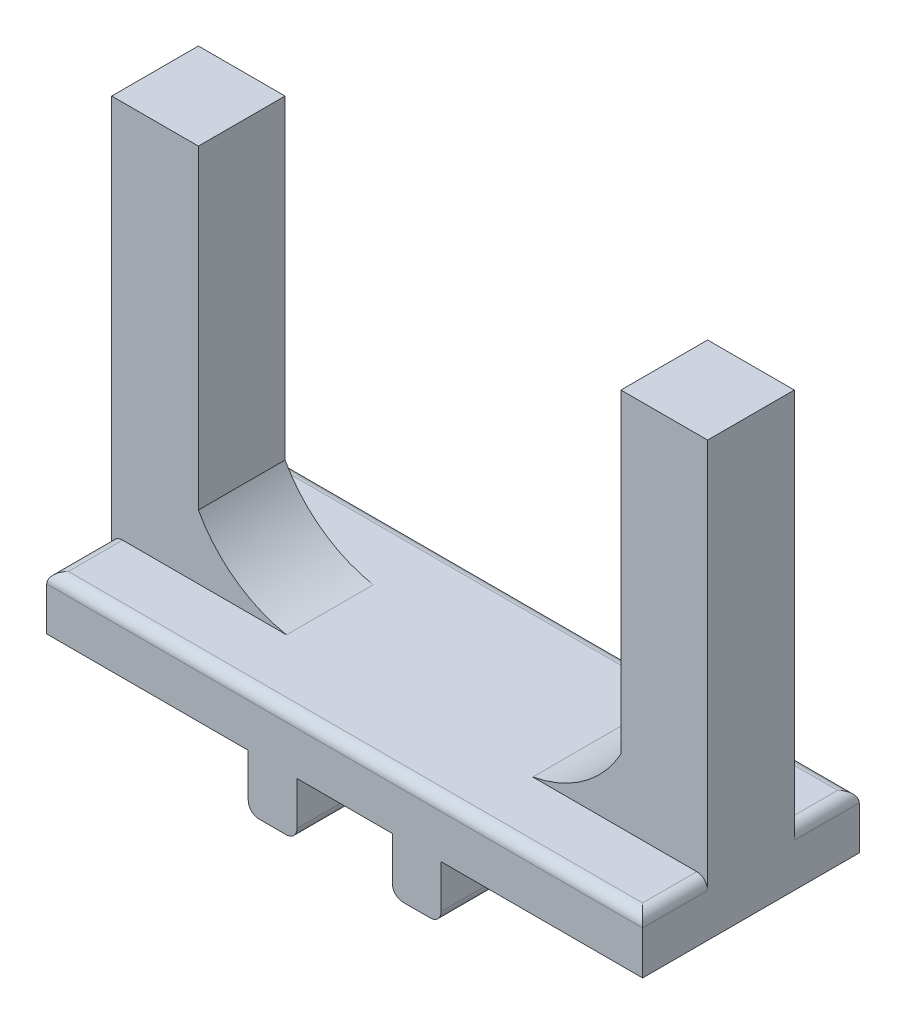
ISO-10303-21;
HEADER;
FILE_DESCRIPTION(('STEP AP214'),'2;1');
FILE_NAME('part.step','',(''),(''),'','','');
FILE_SCHEMA(('AUTOMOTIVE_DESIGN { 1 0 10303 214 1 1 1 1 }'));
ENDSEC;
DATA;
#1=APPLICATION_CONTEXT('core data for automotive mechanical design processes');
#2=APPLICATION_PROTOCOL_DEFINITION('international standard','automotive_design',2000,#1);
#3=PRODUCT_CONTEXT('',#1,'mechanical');
#4=PRODUCT('Part','Part','',(#3));
#5=PRODUCT_RELATED_PRODUCT_CATEGORY('part','',(#4));
#6=PRODUCT_DEFINITION_FORMATION('','',#4);
#7=PRODUCT_DEFINITION_CONTEXT('part definition',#1,'design');
#8=PRODUCT_DEFINITION('design','',#6,#7);
#9=PRODUCT_DEFINITION_SHAPE('','',#8);
#10=(LENGTH_UNIT() NAMED_UNIT(*) SI_UNIT(.MILLI.,.METRE.));
#11=(NAMED_UNIT(*) PLANE_ANGLE_UNIT() SI_UNIT($,.RADIAN.));
#12=(NAMED_UNIT(*) SI_UNIT($,.STERADIAN.) SOLID_ANGLE_UNIT());
#13=UNCERTAINTY_MEASURE_WITH_UNIT(LENGTH_MEASURE(1.E-05),#10,'distance_accuracy_value','');
#14=(GEOMETRIC_REPRESENTATION_CONTEXT(3) GLOBAL_UNCERTAINTY_ASSIGNED_CONTEXT((#13)) GLOBAL_UNIT_ASSIGNED_CONTEXT((#10,
#11,#12)) REPRESENTATION_CONTEXT('',''));
#15=CARTESIAN_POINT('',(0.,0.,0.));
#16=DIRECTION('',(0.,0.,1.));
#17=DIRECTION('',(1.,0.,0.));
#18=AXIS2_PLACEMENT_3D('',#15,#16,#17);
#19=CARTESIAN_POINT('',(0.,2.5,20.));
#20=DIRECTION('',(0.,1.,0.));
#21=DIRECTION('',(0.,0.,1.));
#22=AXIS2_PLACEMENT_3D('',#19,#20,#21);
#23=PLANE('',#22);
#24=DIRECTION('',(0.,0.,1.));
#25=VECTOR('',#24,1.);
#26=CARTESIAN_POINT('',(11.3640938890447,2.5,6.));
#27=LINE('',#26,#25);
#28=CARTESIAN_POINT('',(11.3640938890447,2.5,6.));
#29=VERTEX_POINT('',#28);
#30=CARTESIAN_POINT('',(11.3640938890447,2.5,14.));
#31=VERTEX_POINT('',#30);
#32=EDGE_CURVE('E242',#29,#31,#27,.T.);
#33=ORIENTED_EDGE('',*,*,#32,.F.);
#34=DIRECTION('',(-1.,0.,0.));
#35=VECTOR('',#34,1.);
#36=CARTESIAN_POINT('',(27.5,2.5,5.99999999999999));
#37=LINE('',#36,#35);
#38=CARTESIAN_POINT('',(26.5,2.5,5.99999999999999));
#39=VERTEX_POINT('',#38);
#40=EDGE_CURVE('E248',#39,#29,#37,.T.);
#41=ORIENTED_EDGE('',*,*,#40,.F.);
#42=DIRECTION('',(0.,0.,-1.));
#43=VECTOR('',#42,1.);
#44=CARTESIAN_POINT('',(26.5,2.5,20.));
#45=LINE('',#44,#43);
#46=CARTESIAN_POINT('',(26.5,2.5,1.));
#47=VERTEX_POINT('',#46);
#48=EDGE_CURVE('E435',#39,#47,#45,.T.);
#49=ORIENTED_EDGE('',*,*,#48,.T.);
#50=DIRECTION('',(1.,0.,0.));
#51=VECTOR('',#50,1.);
#52=CARTESIAN_POINT('',(-27.5,2.5,1.));
#53=LINE('',#52,#51);
#54=CARTESIAN_POINT('',(-26.5,2.5,1.));
#55=VERTEX_POINT('',#54);
#56=EDGE_CURVE('E433',#47,#55,#53,.F.);
#57=ORIENTED_EDGE('',*,*,#56,.T.);
#58=DIRECTION('',(0.,0.,-1.));
#59=VECTOR('',#58,1.);
#60=CARTESIAN_POINT('',(-26.5,2.5,6.));
#61=LINE('',#60,#59);
#62=CARTESIAN_POINT('',(-26.5,2.5,6.));
#63=VERTEX_POINT('',#62);
#64=EDGE_CURVE('E431',#55,#63,#61,.F.);
#65=ORIENTED_EDGE('',*,*,#64,.T.);
#66=DIRECTION('',(-1.,0.,0.));
#67=VECTOR('',#66,1.);
#68=CARTESIAN_POINT('',(-27.5,2.5,6.));
#69=LINE('',#68,#67);
#70=CARTESIAN_POINT('',(-11.3640938890447,2.5,6.));
#71=VERTEX_POINT('',#70);
#72=EDGE_CURVE('E57',#71,#63,#69,.T.);
#73=ORIENTED_EDGE('',*,*,#72,.F.);
#74=DIRECTION('',(0.,0.,1.));
#75=VECTOR('',#74,1.);
#76=CARTESIAN_POINT('',(-11.3640938890447,2.5,6.));
#77=LINE('',#76,#75);
#78=CARTESIAN_POINT('',(-11.3640938890447,2.5,14.));
#79=VERTEX_POINT('',#78);
#80=EDGE_CURVE('E275',#71,#79,#77,.T.);
#81=ORIENTED_EDGE('',*,*,#80,.T.);
#82=DIRECTION('',(1.,0.,0.));
#83=VECTOR('',#82,1.);
#84=CARTESIAN_POINT('',(-27.5,2.5,14.));
#85=LINE('',#84,#83);
#86=CARTESIAN_POINT('',(-26.5,2.5,14.));
#87=VERTEX_POINT('',#86);
#88=EDGE_CURVE('E64',#87,#79,#85,.T.);
#89=ORIENTED_EDGE('',*,*,#88,.F.);
#90=DIRECTION('',(0.,0.,-1.));
#91=VECTOR('',#90,1.);
#92=CARTESIAN_POINT('',(-26.5,2.5,20.));
#93=LINE('',#92,#91);
#94=CARTESIAN_POINT('',(-26.5,2.5,19.));
#95=VERTEX_POINT('',#94);
#96=EDGE_CURVE('E428',#87,#95,#93,.F.);
#97=ORIENTED_EDGE('',*,*,#96,.T.);
#98=DIRECTION('',(1.,0.,0.));
#99=VECTOR('',#98,1.);
#100=CARTESIAN_POINT('',(0.,2.5,19.));
#101=LINE('',#100,#99);
#102=CARTESIAN_POINT('',(26.5,2.5,19.));
#103=VERTEX_POINT('',#102);
#104=EDGE_CURVE('E426',#95,#103,#101,.T.);
#105=ORIENTED_EDGE('',*,*,#104,.T.);
#106=DIRECTION('',(0.,0.,-1.));
#107=VECTOR('',#106,1.);
#108=CARTESIAN_POINT('',(26.5,2.5,20.));
#109=LINE('',#108,#107);
#110=CARTESIAN_POINT('',(26.5,2.5,14.));
#111=VERTEX_POINT('',#110);
#112=EDGE_CURVE('E244',#103,#111,#109,.T.);
#113=ORIENTED_EDGE('',*,*,#112,.T.);
#114=DIRECTION('',(1.,0.,0.));
#115=VECTOR('',#114,1.);
#116=CARTESIAN_POINT('',(27.5,2.5,14.));
#117=LINE('',#116,#115);
#118=EDGE_CURVE('E239',#31,#111,#117,.T.);
#119=ORIENTED_EDGE('',*,*,#118,.F.);
#120=EDGE_LOOP('',(#33,#41,#49,#57,#65,#73,#81,#89,#97,#105,#113,#119));
#121=FACE_BOUND('',#120,.T.);
#122=ADVANCED_FACE('F40',(#121),#23,.T.);
#123=CARTESIAN_POINT('',(19.5,37.5,5.99999999999999));
#124=DIRECTION('',(1.,0.,0.));
#125=DIRECTION('',(0.,0.,-1.));
#126=AXIS2_PLACEMENT_3D('',#123,#124,#125);
#127=PLANE('',#126);
#128=DIRECTION('',(0.,0.,1.));
#129=VECTOR('',#128,1.);
#130=CARTESIAN_POINT('',(19.5,8.40506521265491,6.));
#131=LINE('',#130,#129);
#132=CARTESIAN_POINT('',(19.5,8.40506521265491,6.));
#133=VERTEX_POINT('',#132);
#134=CARTESIAN_POINT('',(19.5,8.40506521265491,14.));
#135=VERTEX_POINT('',#134);
#136=EDGE_CURVE('E258',#133,#135,#131,.T.);
#137=ORIENTED_EDGE('',*,*,#136,.T.);
#138=DIRECTION('',(0.,-1.,0.));
#139=VECTOR('',#138,1.);
#140=CARTESIAN_POINT('',(19.5,37.5,14.));
#141=LINE('',#140,#139);
#142=CARTESIAN_POINT('',(19.5,37.5,14.));
#143=VERTEX_POINT('',#142);
#144=EDGE_CURVE('E264',#143,#135,#141,.T.);
#145=ORIENTED_EDGE('',*,*,#144,.F.);
#146=DIRECTION('',(0.,0.,1.));
#147=VECTOR('',#146,1.);
#148=CARTESIAN_POINT('',(19.5,37.5,5.99999999999999));
#149=LINE('',#148,#147);
#150=CARTESIAN_POINT('',(19.5,37.5,5.99999999999999));
#151=VERTEX_POINT('',#150);
#152=EDGE_CURVE('E292',#151,#143,#149,.T.);
#153=ORIENTED_EDGE('',*,*,#152,.F.);
#154=DIRECTION('',(0.,-1.,0.));
#155=VECTOR('',#154,1.);
#156=CARTESIAN_POINT('',(19.5,37.5,5.99999999999999));
#157=LINE('',#156,#155);
#158=EDGE_CURVE('E282',#151,#133,#157,.T.);
#159=ORIENTED_EDGE('',*,*,#158,.T.);
#160=EDGE_LOOP('',(#137,#145,#153,#159));
#161=FACE_BOUND('',#160,.T.);
#162=ADVANCED_FACE('F500',(#161),#127,.F.);
#163=CARTESIAN_POINT('',(27.5,0.,20.));
#164=DIRECTION('',(1.,0.,0.));
#165=DIRECTION('',(0.,0.,-1.));
#166=AXIS2_PLACEMENT_3D('',#163,#164,#165);
#167=PLANE('',#166);
#168=DIRECTION('',(0.,-1.,0.));
#169=VECTOR('',#168,1.);
#170=CARTESIAN_POINT('',(27.5,0.,0.));
#171=LINE('',#170,#169);
#172=CARTESIAN_POINT('',(27.5,1.5,0.));
#173=VERTEX_POINT('',#172);
#174=CARTESIAN_POINT('',(27.5,-2.5,0.));
#175=VERTEX_POINT('',#174);
#176=EDGE_CURVE('E318',#173,#175,#171,.T.);
#177=ORIENTED_EDGE('',*,*,#176,.F.);
#178=DIRECTION('',(0.,0.,-1.));
#179=VECTOR('',#178,1.);
#180=CARTESIAN_POINT('',(27.5,1.5,20.));
#181=LINE('',#180,#179);
#182=CARTESIAN_POINT('',(27.5,1.5,5.99999999999999));
#183=VERTEX_POINT('',#182);
#184=EDGE_CURVE('E440',#173,#183,#181,.F.);
#185=ORIENTED_EDGE('',*,*,#184,.T.);
#186=DIRECTION('',(0.,-1.,0.));
#187=VECTOR('',#186,1.);
#188=CARTESIAN_POINT('',(27.5,37.5,5.99999999999999));
#189=LINE('',#188,#187);
#190=CARTESIAN_POINT('',(27.5,37.5,5.99999999999999));
#191=VERTEX_POINT('',#190);
#192=EDGE_CURVE('E280',#191,#183,#189,.T.);
#193=ORIENTED_EDGE('',*,*,#192,.F.);
#194=DIRECTION('',(0.,0.,-1.));
#195=VECTOR('',#194,1.);
#196=CARTESIAN_POINT('',(27.5,37.5,5.99999999999999));
#197=LINE('',#196,#195);
#198=CARTESIAN_POINT('',(27.5,37.5,14.));
#199=VERTEX_POINT('',#198);
#200=EDGE_CURVE('E249',#199,#191,#197,.T.);
#201=ORIENTED_EDGE('',*,*,#200,.F.);
#202=DIRECTION('',(0.,-1.,0.));
#203=VECTOR('',#202,1.);
#204=CARTESIAN_POINT('',(27.5,37.5,14.));
#205=LINE('',#204,#203);
#206=CARTESIAN_POINT('',(27.5,1.5,14.));
#207=VERTEX_POINT('',#206);
#208=EDGE_CURVE('E287',#199,#207,#205,.T.);
#209=ORIENTED_EDGE('',*,*,#208,.T.);
#210=DIRECTION('',(0.,0.,-1.));
#211=VECTOR('',#210,1.);
#212=CARTESIAN_POINT('',(27.5,1.5,20.));
#213=LINE('',#212,#211);
#214=CARTESIAN_POINT('',(27.5,1.5,20.));
#215=VERTEX_POINT('',#214);
#216=EDGE_CURVE('E438',#207,#215,#213,.F.);
#217=ORIENTED_EDGE('',*,*,#216,.T.);
#218=DIRECTION('',(0.,-1.,0.));
#219=VECTOR('',#218,1.);
#220=CARTESIAN_POINT('',(27.5,0.,20.));
#221=LINE('',#220,#219);
#222=CARTESIAN_POINT('',(27.5,-2.5,20.));
#223=VERTEX_POINT('',#222);
#224=EDGE_CURVE('E319',#215,#223,#221,.T.);
#225=ORIENTED_EDGE('',*,*,#224,.T.);
#226=DIRECTION('',(0.,0.,-1.));
#227=VECTOR('',#226,1.);
#228=CARTESIAN_POINT('',(27.5,-2.5,20.));
#229=LINE('',#228,#227);
#230=EDGE_CURVE('E370',#223,#175,#229,.T.);
#231=ORIENTED_EDGE('',*,*,#230,.T.);
#232=EDGE_LOOP('',(#177,#185,#193,#201,#209,#217,#225,#231));
#233=FACE_BOUND('',#232,.T.);
#234=ADVANCED_FACE('F489',(#233),#167,.T.);
#235=CARTESIAN_POINT('',(-27.5,0.,20.));
#236=DIRECTION('',(1.,0.,0.));
#237=DIRECTION('',(0.,0.,-1.));
#238=AXIS2_PLACEMENT_3D('',#235,#236,#237);
#239=PLANE('',#238);
#240=DIRECTION('',(0.,-1.,0.));
#241=VECTOR('',#240,1.);
#242=CARTESIAN_POINT('',(-27.5,37.5,6.));
#243=LINE('',#242,#241);
#244=CARTESIAN_POINT('',(-27.5,37.5,6.));
#245=VERTEX_POINT('',#244);
#246=CARTESIAN_POINT('',(-27.5,1.5,6.));
#247=VERTEX_POINT('',#246);
#248=EDGE_CURVE('E313',#245,#247,#243,.T.);
#249=ORIENTED_EDGE('',*,*,#248,.T.);
#250=DIRECTION('',(0.,0.,-1.));
#251=VECTOR('',#250,1.);
#252=CARTESIAN_POINT('',(-27.5,1.5,0.));
#253=LINE('',#252,#251);
#254=CARTESIAN_POINT('',(-27.5,1.5,0.));
#255=VERTEX_POINT('',#254);
#256=EDGE_CURVE('E446',#247,#255,#253,.T.);
#257=ORIENTED_EDGE('',*,*,#256,.T.);
#258=DIRECTION('',(0.,-1.,0.));
#259=VECTOR('',#258,1.);
#260=CARTESIAN_POINT('',(-27.5,0.,0.));
#261=LINE('',#260,#259);
#262=CARTESIAN_POINT('',(-27.5,-2.5,0.));
#263=VERTEX_POINT('',#262);
#264=EDGE_CURVE('E347',#255,#263,#261,.T.);
#265=ORIENTED_EDGE('',*,*,#264,.T.);
#266=DIRECTION('',(0.,0.,-1.));
#267=VECTOR('',#266,1.);
#268=CARTESIAN_POINT('',(-27.5,-2.5,20.));
#269=LINE('',#268,#267);
#270=CARTESIAN_POINT('',(-27.5,-2.5,20.));
#271=VERTEX_POINT('',#270);
#272=EDGE_CURVE('E383',#271,#263,#269,.T.);
#273=ORIENTED_EDGE('',*,*,#272,.F.);
#274=DIRECTION('',(0.,-1.,0.));
#275=VECTOR('',#274,1.);
#276=CARTESIAN_POINT('',(-27.5,0.,20.));
#277=LINE('',#276,#275);
#278=CARTESIAN_POINT('',(-27.5,1.5,20.));
#279=VERTEX_POINT('',#278);
#280=EDGE_CURVE('E321',#279,#271,#277,.T.);
#281=ORIENTED_EDGE('',*,*,#280,.F.);
#282=DIRECTION('',(0.,0.,-1.));
#283=VECTOR('',#282,1.);
#284=CARTESIAN_POINT('',(-27.5,1.5,14.));
#285=LINE('',#284,#283);
#286=CARTESIAN_POINT('',(-27.5,1.5,14.));
#287=VERTEX_POINT('',#286);
#288=EDGE_CURVE('E443',#279,#287,#285,.T.);
#289=ORIENTED_EDGE('',*,*,#288,.T.);
#290=DIRECTION('',(0.,-1.,0.));
#291=VECTOR('',#290,1.);
#292=CARTESIAN_POINT('',(-27.5,37.5,14.));
#293=LINE('',#292,#291);
#294=CARTESIAN_POINT('',(-27.5,37.5,14.));
#295=VERTEX_POINT('',#294);
#296=EDGE_CURVE('E311',#295,#287,#293,.T.);
#297=ORIENTED_EDGE('',*,*,#296,.F.);
#298=DIRECTION('',(0.,0.,1.));
#299=VECTOR('',#298,1.);
#300=CARTESIAN_POINT('',(-27.5,37.5,6.));
#301=LINE('',#300,#299);
#302=EDGE_CURVE('E303',#245,#295,#301,.T.);
#303=ORIENTED_EDGE('',*,*,#302,.F.);
#304=EDGE_LOOP('',(#249,#257,#265,#273,#281,#289,#297,#303));
#305=FACE_BOUND('',#304,.T.);
#306=ADVANCED_FACE('F474',(#305),#239,.F.);
#307=CARTESIAN_POINT('',(0.,-2.5,20.));
#308=DIRECTION('',(0.,1.,0.));
#309=DIRECTION('',(0.,0.,1.));
#310=AXIS2_PLACEMENT_3D('',#307,#308,#309);
#311=PLANE('',#310);
#312=DIRECTION('',(1.,0.,0.));
#313=VECTOR('',#312,1.);
#314=CARTESIAN_POINT('',(0.,-2.5,0.));
#315=LINE('',#314,#313);
#316=CARTESIAN_POINT('',(-8.9,-2.5,0.));
#317=VERTEX_POINT('',#316);
#318=EDGE_CURVE('E349',#263,#317,#315,.T.);
#319=ORIENTED_EDGE('',*,*,#318,.T.);
#320=DIRECTION('',(0.,0.,-1.));
#321=VECTOR('',#320,1.);
#322=CARTESIAN_POINT('',(-8.9,-2.5,20.));
#323=LINE('',#322,#321);
#324=CARTESIAN_POINT('',(-8.9,-2.5,20.));
#325=VERTEX_POINT('',#324);
#326=EDGE_CURVE('E380',#325,#317,#323,.T.);
#327=ORIENTED_EDGE('',*,*,#326,.F.);
#328=DIRECTION('',(1.,0.,0.));
#329=VECTOR('',#328,1.);
#330=CARTESIAN_POINT('',(0.,-2.5,20.));
#331=LINE('',#330,#329);
#332=EDGE_CURVE('E324',#271,#325,#331,.T.);
#333=ORIENTED_EDGE('',*,*,#332,.F.);
#334=ORIENTED_EDGE('',*,*,#272,.T.);
#335=EDGE_LOOP('',(#319,#327,#333,#334));
#336=FACE_BOUND('',#335,.T.);
#337=ADVANCED_FACE('F540',(#336),#311,.F.);
#338=CARTESIAN_POINT('',(-8.9,0.,20.));
#339=DIRECTION('',(1.,0.,0.));
#340=DIRECTION('',(0.,1.,0.));
#341=AXIS2_PLACEMENT_3D('',#338,#339,#340);
#342=PLANE('',#341);
#343=DIRECTION('',(0.,-1.,0.));
#344=VECTOR('',#343,1.);
#345=CARTESIAN_POINT('',(-8.9,0.,0.));
#346=LINE('',#345,#344);
#347=CARTESIAN_POINT('',(-8.9,-6.5,0.));
#348=VERTEX_POINT('',#347);
#349=EDGE_CURVE('E351',#317,#348,#346,.T.);
#350=ORIENTED_EDGE('',*,*,#349,.T.);
#351=DIRECTION('',(0.,0.,-1.));
#352=VECTOR('',#351,1.);
#353=CARTESIAN_POINT('',(-8.9,-6.5,20.));
#354=LINE('',#353,#352);
#355=CARTESIAN_POINT('',(-8.9,-6.5,20.));
#356=VERTEX_POINT('',#355);
#357=EDGE_CURVE('E424',#348,#356,#354,.F.);
#358=ORIENTED_EDGE('',*,*,#357,.T.);
#359=DIRECTION('',(0.,-1.,0.));
#360=VECTOR('',#359,1.);
#361=CARTESIAN_POINT('',(-8.9,0.,20.));
#362=LINE('',#361,#360);
#363=EDGE_CURVE('E326',#325,#356,#362,.T.);
#364=ORIENTED_EDGE('',*,*,#363,.F.);
#365=ORIENTED_EDGE('',*,*,#326,.T.);
#366=EDGE_LOOP('',(#350,#358,#364,#365));
#367=FACE_BOUND('',#366,.T.);
#368=ADVANCED_FACE('F543',(#367),#342,.F.);
#369=CARTESIAN_POINT('',(0.,-7.5,20.));
#370=DIRECTION('',(0.,1.,0.));
#371=DIRECTION('',(-1.,0.,0.));
#372=AXIS2_PLACEMENT_3D('',#369,#370,#371);
#373=PLANE('',#372);
#374=DIRECTION('',(1.,0.,0.));
#375=VECTOR('',#374,1.);
#376=CARTESIAN_POINT('',(0.,-7.5,0.));
#377=LINE('',#376,#375);
#378=CARTESIAN_POINT('',(-7.9,-7.5,0.));
#379=VERTEX_POINT('',#378);
#380=CARTESIAN_POINT('',(-5.4,-7.5,0.));
#381=VERTEX_POINT('',#380);
#382=EDGE_CURVE('E355',#379,#381,#377,.T.);
#383=ORIENTED_EDGE('',*,*,#382,.T.);
#384=DIRECTION('',(0.,0.,-1.));
#385=VECTOR('',#384,1.);
#386=CARTESIAN_POINT('',(-5.4,-7.5,20.));
#387=LINE('',#386,#385);
#388=CARTESIAN_POINT('',(-5.4,-7.5,20.));
#389=VERTEX_POINT('',#388);
#390=EDGE_CURVE('E402',#381,#389,#387,.F.);
#391=ORIENTED_EDGE('',*,*,#390,.T.);
#392=DIRECTION('',(1.,0.,0.));
#393=VECTOR('',#392,1.);
#394=CARTESIAN_POINT('',(0.,-7.5,20.));
#395=LINE('',#394,#393);
#396=CARTESIAN_POINT('',(-7.9,-7.5,20.));
#397=VERTEX_POINT('',#396);
#398=EDGE_CURVE('E331',#397,#389,#395,.T.);
#399=ORIENTED_EDGE('',*,*,#398,.F.);
#400=DIRECTION('',(0.,0.,-1.));
#401=VECTOR('',#400,1.);
#402=CARTESIAN_POINT('',(-7.9,-7.5,20.));
#403=LINE('',#402,#401);
#404=EDGE_CURVE('E399',#397,#379,#403,.T.);
#405=ORIENTED_EDGE('',*,*,#404,.T.);
#406=EDGE_LOOP('',(#383,#391,#399,#405));
#407=FACE_BOUND('',#406,.T.);
#408=ADVANCED_FACE('F552',(#407),#373,.F.);
#409=CARTESIAN_POINT('',(-4.4,0.,20.));
#410=DIRECTION('',(1.,0.,0.));
#411=DIRECTION('',(0.,0.,-1.));
#412=AXIS2_PLACEMENT_3D('',#409,#410,#411);
#413=PLANE('',#412);
#414=DIRECTION('',(0.,-1.,0.));
#415=VECTOR('',#414,1.);
#416=CARTESIAN_POINT('',(-4.4,0.,20.));
#417=LINE('',#416,#415);
#418=CARTESIAN_POINT('',(-4.4,-2.5,20.));
#419=VERTEX_POINT('',#418);
#420=CARTESIAN_POINT('',(-4.4,-6.5,20.));
#421=VERTEX_POINT('',#420);
#422=EDGE_CURVE('E334',#419,#421,#417,.T.);
#423=ORIENTED_EDGE('',*,*,#422,.T.);
#424=DIRECTION('',(0.,0.,-1.));
#425=VECTOR('',#424,1.);
#426=CARTESIAN_POINT('',(-4.4,-6.5,0.));
#427=LINE('',#426,#425);
#428=CARTESIAN_POINT('',(-4.4,-6.5,0.));
#429=VERTEX_POINT('',#428);
#430=EDGE_CURVE('E386',#421,#429,#427,.T.);
#431=ORIENTED_EDGE('',*,*,#430,.T.);
#432=DIRECTION('',(0.,-1.,0.));
#433=VECTOR('',#432,1.);
#434=CARTESIAN_POINT('',(-4.4,0.,0.));
#435=LINE('',#434,#433);
#436=CARTESIAN_POINT('',(-4.4,-2.5,0.));
#437=VERTEX_POINT('',#436);
#438=EDGE_CURVE('E358',#437,#429,#435,.T.);
#439=ORIENTED_EDGE('',*,*,#438,.F.);
#440=DIRECTION('',(0.,0.,-1.));
#441=VECTOR('',#440,1.);
#442=CARTESIAN_POINT('',(-4.4,-2.5,20.));
#443=LINE('',#442,#441);
#444=EDGE_CURVE('E378',#419,#437,#443,.T.);
#445=ORIENTED_EDGE('',*,*,#444,.F.);
#446=EDGE_LOOP('',(#423,#431,#439,#445));
#447=FACE_BOUND('',#446,.T.);
#448=ADVANCED_FACE('F561',(#447),#413,.T.);
#449=CARTESIAN_POINT('',(4.4,-2.5,0.));
#450=VERTEX_POINT('',#449);
#451=EDGE_CURVE('E352',#437,#450,#315,.T.);
#452=ORIENTED_EDGE('',*,*,#451,.T.);
#453=DIRECTION('',(0.,0.,-1.));
#454=VECTOR('',#453,1.);
#455=CARTESIAN_POINT('',(4.4,-2.5,20.));
#456=LINE('',#455,#454);
#457=CARTESIAN_POINT('',(4.4,-2.5,20.));
#458=VERTEX_POINT('',#457);
#459=EDGE_CURVE('E375',#458,#450,#456,.T.);
#460=ORIENTED_EDGE('',*,*,#459,.F.);
#461=EDGE_CURVE('E328',#419,#458,#331,.T.);
#462=ORIENTED_EDGE('',*,*,#461,.F.);
#463=ORIENTED_EDGE('',*,*,#444,.T.);
#464=EDGE_LOOP('',(#452,#460,#462,#463));
#465=FACE_BOUND('',#464,.T.);
#466=ADVANCED_FACE('F568',(#465),#311,.F.);
#467=CARTESIAN_POINT('',(4.4,0.,20.));
#468=DIRECTION('',(1.,0.,0.));
#469=DIRECTION('',(0.,1.,0.));
#470=AXIS2_PLACEMENT_3D('',#467,#468,#469);
#471=PLANE('',#470);
#472=DIRECTION('',(0.,-1.,0.));
#473=VECTOR('',#472,1.);
#474=CARTESIAN_POINT('',(4.4,0.,0.));
#475=LINE('',#474,#473);
#476=CARTESIAN_POINT('',(4.4,-6.5,0.));
#477=VERTEX_POINT('',#476);
#478=EDGE_CURVE('E361',#450,#477,#475,.T.);
#479=ORIENTED_EDGE('',*,*,#478,.T.);
#480=DIRECTION('',(0.,0.,-1.));
#481=VECTOR('',#480,1.);
#482=CARTESIAN_POINT('',(4.4,-6.5,20.));
#483=LINE('',#482,#481);
#484=CARTESIAN_POINT('',(4.4,-6.5,20.));
#485=VERTEX_POINT('',#484);
#486=EDGE_CURVE('E419',#477,#485,#483,.F.);
#487=ORIENTED_EDGE('',*,*,#486,.T.);
#488=DIRECTION('',(0.,-1.,0.));
#489=VECTOR('',#488,1.);
#490=CARTESIAN_POINT('',(4.4,0.,20.));
#491=LINE('',#490,#489);
#492=EDGE_CURVE('E337',#458,#485,#491,.T.);
#493=ORIENTED_EDGE('',*,*,#492,.F.);
#494=ORIENTED_EDGE('',*,*,#459,.T.);
#495=EDGE_LOOP('',(#479,#487,#493,#494));
#496=FACE_BOUND('',#495,.T.);
#497=ADVANCED_FACE('F571',(#496),#471,.F.);
#498=CARTESIAN_POINT('',(0.,-7.5,20.));
#499=DIRECTION('',(0.,1.,0.));
#500=DIRECTION('',(-1.,0.,0.));
#501=AXIS2_PLACEMENT_3D('',#498,#499,#500);
#502=PLANE('',#501);
#503=DIRECTION('',(1.,0.,0.));
#504=VECTOR('',#503,1.);
#505=CARTESIAN_POINT('',(0.,-7.5,20.));
#506=LINE('',#505,#504);
#507=CARTESIAN_POINT('',(5.4,-7.5,20.));
#508=VERTEX_POINT('',#507);
#509=CARTESIAN_POINT('',(7.9,-7.5,20.));
#510=VERTEX_POINT('',#509);
#511=EDGE_CURVE('E340',#508,#510,#506,.T.);
#512=ORIENTED_EDGE('',*,*,#511,.F.);
#513=DIRECTION('',(0.,0.,-1.));
#514=VECTOR('',#513,1.);
#515=CARTESIAN_POINT('',(5.4,-7.5,20.));
#516=LINE('',#515,#514);
#517=CARTESIAN_POINT('',(5.4,-7.5,0.));
#518=VERTEX_POINT('',#517);
#519=EDGE_CURVE('E416',#508,#518,#516,.T.);
#520=ORIENTED_EDGE('',*,*,#519,.T.);
#521=DIRECTION('',(1.,0.,0.));
#522=VECTOR('',#521,1.);
#523=CARTESIAN_POINT('',(0.,-7.5,0.));
#524=LINE('',#523,#522);
#525=CARTESIAN_POINT('',(7.9,-7.5,0.));
#526=VERTEX_POINT('',#525);
#527=EDGE_CURVE('E364',#518,#526,#524,.T.);
#528=ORIENTED_EDGE('',*,*,#527,.T.);
#529=DIRECTION('',(0.,0.,-1.));
#530=VECTOR('',#529,1.);
#531=CARTESIAN_POINT('',(7.9,-7.5,20.));
#532=LINE('',#531,#530);
#533=EDGE_CURVE('E414',#526,#510,#532,.F.);
#534=ORIENTED_EDGE('',*,*,#533,.T.);
#535=EDGE_LOOP('',(#512,#520,#528,#534));
#536=FACE_BOUND('',#535,.T.);
#537=ADVANCED_FACE('F579',(#536),#502,.F.);
#538=CARTESIAN_POINT('',(8.9,0.,20.));
#539=DIRECTION('',(1.,0.,0.));
#540=DIRECTION('',(0.,0.,-1.));
#541=AXIS2_PLACEMENT_3D('',#538,#539,#540);
#542=PLANE('',#541);
#543=DIRECTION('',(0.,-1.,0.));
#544=VECTOR('',#543,1.);
#545=CARTESIAN_POINT('',(8.9,0.,20.));
#546=LINE('',#545,#544);
#547=CARTESIAN_POINT('',(8.9,-2.5,20.));
#548=VERTEX_POINT('',#547);
#549=CARTESIAN_POINT('',(8.9,-6.5,20.));
#550=VERTEX_POINT('',#549);
#551=EDGE_CURVE('E343',#548,#550,#546,.T.);
#552=ORIENTED_EDGE('',*,*,#551,.T.);
#553=DIRECTION('',(0.,0.,-1.));
#554=VECTOR('',#553,1.);
#555=CARTESIAN_POINT('',(8.9,-6.5,0.));
#556=LINE('',#555,#554);
#557=CARTESIAN_POINT('',(8.9,-6.5,0.));
#558=VERTEX_POINT('',#557);
#559=EDGE_CURVE('E421',#550,#558,#556,.T.);
#560=ORIENTED_EDGE('',*,*,#559,.T.);
#561=DIRECTION('',(0.,-1.,0.));
#562=VECTOR('',#561,1.);
#563=CARTESIAN_POINT('',(8.9,0.,0.));
#564=LINE('',#563,#562);
#565=CARTESIAN_POINT('',(8.9,-2.5,0.));
#566=VERTEX_POINT('',#565);
#567=EDGE_CURVE('E367',#566,#558,#564,.T.);
#568=ORIENTED_EDGE('',*,*,#567,.F.);
#569=DIRECTION('',(0.,0.,-1.));
#570=VECTOR('',#569,1.);
#571=CARTESIAN_POINT('',(8.9,-2.5,20.));
#572=LINE('',#571,#570);
#573=EDGE_CURVE('E373',#548,#566,#572,.T.);
#574=ORIENTED_EDGE('',*,*,#573,.F.);
#575=EDGE_LOOP('',(#552,#560,#568,#574));
#576=FACE_BOUND('',#575,.T.);
#577=ADVANCED_FACE('F586',(#576),#542,.T.);
#578=EDGE_CURVE('E322',#566,#175,#315,.T.);
#579=ORIENTED_EDGE('',*,*,#578,.T.);
#580=ORIENTED_EDGE('',*,*,#230,.F.);
#581=EDGE_CURVE('E327',#548,#223,#331,.T.);
#582=ORIENTED_EDGE('',*,*,#581,.F.);
#583=ORIENTED_EDGE('',*,*,#573,.T.);
#584=EDGE_LOOP('',(#579,#580,#582,#583));
#585=FACE_BOUND('',#584,.T.);
#586=ADVANCED_FACE('F590',(#585),#311,.F.);
#587=CARTESIAN_POINT('',(0.,0.,20.));
#588=DIRECTION('',(0.,0.,1.));
#589=DIRECTION('',(1.,0.,0.));
#590=AXIS2_PLACEMENT_3D('',#587,#588,#589);
#591=PLANE('',#590);
#592=ORIENTED_EDGE('',*,*,#398,.T.);
#593=CARTESIAN_POINT('',(-5.4,-6.5,20.));
#594=DIRECTION('',(0.,0.,1.));
#595=DIRECTION('',(1.,0.,0.));
#596=AXIS2_PLACEMENT_3D('',#593,#594,#595);
#597=CIRCLE('',#596,1.);
#598=EDGE_CURVE('E412',#389,#421,#597,.T.);
#599=ORIENTED_EDGE('',*,*,#598,.T.);
#600=ORIENTED_EDGE('',*,*,#422,.F.);
#601=ORIENTED_EDGE('',*,*,#461,.T.);
#602=ORIENTED_EDGE('',*,*,#492,.T.);
#603=CARTESIAN_POINT('',(5.4,-6.5,20.));
#604=DIRECTION('',(0.,0.,1.));
#605=DIRECTION('',(1.,0.,0.));
#606=AXIS2_PLACEMENT_3D('',#603,#604,#605);
#607=CIRCLE('',#606,1.);
#608=EDGE_CURVE('E410',#485,#508,#607,.T.);
#609=ORIENTED_EDGE('',*,*,#608,.T.);
#610=ORIENTED_EDGE('',*,*,#511,.T.);
#611=CARTESIAN_POINT('',(7.9,-6.5,20.));
#612=DIRECTION('',(0.,0.,1.));
#613=DIRECTION('',(1.,0.,0.));
#614=AXIS2_PLACEMENT_3D('',#611,#612,#613);
#615=CIRCLE('',#614,1.);
#616=EDGE_CURVE('E408',#510,#550,#615,.T.);
#617=ORIENTED_EDGE('',*,*,#616,.T.);
#618=ORIENTED_EDGE('',*,*,#551,.F.);
#619=ORIENTED_EDGE('',*,*,#581,.T.);
#620=ORIENTED_EDGE('',*,*,#224,.F.);
#621=DIRECTION('',(1.,0.,0.));
#622=VECTOR('',#621,1.);
#623=CARTESIAN_POINT('',(0.,1.5,20.));
#624=LINE('',#623,#622);
#625=EDGE_CURVE('E404',#215,#279,#624,.F.);
#626=ORIENTED_EDGE('',*,*,#625,.T.);
#627=ORIENTED_EDGE('',*,*,#280,.T.);
#628=ORIENTED_EDGE('',*,*,#332,.T.);
#629=ORIENTED_EDGE('',*,*,#363,.T.);
#630=CARTESIAN_POINT('',(-7.9,-6.5,20.));
#631=DIRECTION('',(0.,0.,1.));
#632=DIRECTION('',(1.,0.,0.));
#633=AXIS2_PLACEMENT_3D('',#630,#631,#632);
#634=CIRCLE('',#633,1.);
#635=EDGE_CURVE('E406',#356,#397,#634,.T.);
#636=ORIENTED_EDGE('',*,*,#635,.T.);
#637=EDGE_LOOP('',(#592,#599,#600,#601,#602,#609,#610,#617,#618,#619,#620,#626,#627,#628,#629,#636));
#638=FACE_BOUND('',#637,.T.);
#639=ADVANCED_FACE('F480',(#638),#591,.T.);
#640=CARTESIAN_POINT('',(0.,0.,0.));
#641=DIRECTION('',(0.,0.,1.));
#642=DIRECTION('',(1.,0.,0.));
#643=AXIS2_PLACEMENT_3D('',#640,#641,#642);
#644=PLANE('',#643);
#645=ORIENTED_EDGE('',*,*,#438,.T.);
#646=CARTESIAN_POINT('',(-5.4,-6.5,0.));
#647=DIRECTION('',(0.,0.,1.));
#648=DIRECTION('',(1.,0.,0.));
#649=AXIS2_PLACEMENT_3D('',#646,#647,#648);
#650=CIRCLE('',#649,1.);
#651=EDGE_CURVE('E397',#429,#381,#650,.F.);
#652=ORIENTED_EDGE('',*,*,#651,.T.);
#653=ORIENTED_EDGE('',*,*,#382,.F.);
#654=CARTESIAN_POINT('',(-7.9,-6.5,0.));
#655=DIRECTION('',(0.,0.,1.));
#656=DIRECTION('',(1.,0.,0.));
#657=AXIS2_PLACEMENT_3D('',#654,#655,#656);
#658=CIRCLE('',#657,1.);
#659=EDGE_CURVE('E391',#379,#348,#658,.F.);
#660=ORIENTED_EDGE('',*,*,#659,.T.);
#661=ORIENTED_EDGE('',*,*,#349,.F.);
#662=ORIENTED_EDGE('',*,*,#318,.F.);
#663=ORIENTED_EDGE('',*,*,#264,.F.);
#664=DIRECTION('',(1.,0.,0.));
#665=VECTOR('',#664,1.);
#666=CARTESIAN_POINT('',(27.5,1.5,0.));
#667=LINE('',#666,#665);
#668=EDGE_CURVE('E389',#255,#173,#667,.T.);
#669=ORIENTED_EDGE('',*,*,#668,.T.);
#670=ORIENTED_EDGE('',*,*,#176,.T.);
#671=ORIENTED_EDGE('',*,*,#578,.F.);
#672=ORIENTED_EDGE('',*,*,#567,.T.);
#673=CARTESIAN_POINT('',(7.9,-6.5,0.));
#674=DIRECTION('',(0.,0.,1.));
#675=DIRECTION('',(1.,0.,0.));
#676=AXIS2_PLACEMENT_3D('',#673,#674,#675);
#677=CIRCLE('',#676,1.);
#678=EDGE_CURVE('E393',#558,#526,#677,.F.);
#679=ORIENTED_EDGE('',*,*,#678,.T.);
#680=ORIENTED_EDGE('',*,*,#527,.F.);
#681=CARTESIAN_POINT('',(5.4,-6.5,0.));
#682=DIRECTION('',(0.,0.,1.));
#683=DIRECTION('',(1.,0.,0.));
#684=AXIS2_PLACEMENT_3D('',#681,#682,#683);
#685=CIRCLE('',#684,1.);
#686=EDGE_CURVE('E395',#518,#477,#685,.F.);
#687=ORIENTED_EDGE('',*,*,#686,.T.);
#688=ORIENTED_EDGE('',*,*,#478,.F.);
#689=ORIENTED_EDGE('',*,*,#451,.F.);
#690=EDGE_LOOP('',(#645,#652,#653,#660,#661,#662,#663,#669,#670,#671,#672,#679,#680,#687,#688,#689));
#691=FACE_BOUND('',#690,.T.);
#692=ADVANCED_FACE('F537',(#691),#644,.F.);
#693=CARTESIAN_POINT('',(-19.5,37.5,6.));
#694=DIRECTION('',(-1.,0.,0.));
#695=DIRECTION('',(0.,0.,1.));
#696=AXIS2_PLACEMENT_3D('',#693,#694,#695);
#697=PLANE('',#696);
#698=DIRECTION('',(0.,-1.,0.));
#699=VECTOR('',#698,1.);
#700=CARTESIAN_POINT('',(-19.5,37.5,14.));
#701=LINE('',#700,#699);
#702=CARTESIAN_POINT('',(-19.5,37.5,14.));
#703=VERTEX_POINT('',#702);
#704=CARTESIAN_POINT('',(-19.5,8.4050652126549,14.));
#705=VERTEX_POINT('',#704);
#706=EDGE_CURVE('E307',#703,#705,#701,.T.);
#707=ORIENTED_EDGE('',*,*,#706,.T.);
#708=DIRECTION('',(0.,0.,1.));
#709=VECTOR('',#708,1.);
#710=CARTESIAN_POINT('',(-19.5,8.40506521265491,6.));
#711=LINE('',#710,#709);
#712=CARTESIAN_POINT('',(-19.5,8.4050652126549,6.));
#713=VERTEX_POINT('',#712);
#714=EDGE_CURVE('E274',#713,#705,#711,.T.);
#715=ORIENTED_EDGE('',*,*,#714,.F.);
#716=DIRECTION('',(0.,-1.,0.));
#717=VECTOR('',#716,1.);
#718=CARTESIAN_POINT('',(-19.5,37.5,6.));
#719=LINE('',#718,#717);
#720=CARTESIAN_POINT('',(-19.5,37.5,6.));
#721=VERTEX_POINT('',#720);
#722=EDGE_CURVE('E315',#721,#713,#719,.T.);
#723=ORIENTED_EDGE('',*,*,#722,.F.);
#724=DIRECTION('',(0.,0.,-1.));
#725=VECTOR('',#724,1.);
#726=CARTESIAN_POINT('',(-19.5,37.5,6.));
#727=LINE('',#726,#725);
#728=EDGE_CURVE('E298',#703,#721,#727,.T.);
#729=ORIENTED_EDGE('',*,*,#728,.F.);
#730=EDGE_LOOP('',(#707,#715,#723,#729));
#731=FACE_BOUND('',#730,.T.);
#732=ADVANCED_FACE('F531',(#731),#697,.F.);
#733=CARTESIAN_POINT('',(-27.5,37.5,6.));
#734=DIRECTION('',(0.,0.,1.));
#735=DIRECTION('',(1.,0.,0.));
#736=AXIS2_PLACEMENT_3D('',#733,#734,#735);
#737=PLANE('',#736);
#738=ORIENTED_EDGE('',*,*,#72,.T.);
#739=CARTESIAN_POINT('',(-26.5,1.5,6.));
#740=DIRECTION('',(0.,0.,1.));
#741=DIRECTION('',(1.,0.,0.));
#742=AXIS2_PLACEMENT_3D('',#739,#740,#741);
#743=CIRCLE('',#742,1.);
#744=EDGE_CURVE('E49',#63,#247,#743,.T.);
#745=ORIENTED_EDGE('',*,*,#744,.T.);
#746=ORIENTED_EDGE('',*,*,#248,.F.);
#747=DIRECTION('',(-1.,0.,0.));
#748=VECTOR('',#747,1.);
#749=CARTESIAN_POINT('',(-27.5,37.5,6.));
#750=LINE('',#749,#748);
#751=EDGE_CURVE('E301',#721,#245,#750,.T.);
#752=ORIENTED_EDGE('',*,*,#751,.F.);
#753=ORIENTED_EDGE('',*,*,#722,.T.);
#754=CARTESIAN_POINT('',(-9.15825791238478,14.0964606049589,6.));
#755=DIRECTION('',(0.,0.,-1.));
#756=DIRECTION('',(1.,0.,0.));
#757=AXIS2_PLACEMENT_3D('',#754,#755,#756);
#758=CIRCLE('',#757,11.8043894767282);
#759=EDGE_CURVE('E271',#71,#713,#758,.T.);
#760=ORIENTED_EDGE('',*,*,#759,.F.);
#761=EDGE_LOOP('',(#738,#745,#746,#752,#753,#760));
#762=FACE_BOUND('',#761,.T.);
#763=ADVANCED_FACE('F521',(#762),#737,.F.);
#764=CARTESIAN_POINT('',(-27.5,37.5,14.));
#765=DIRECTION('',(0.,0.,-1.));
#766=DIRECTION('',(-1.,0.,0.));
#767=AXIS2_PLACEMENT_3D('',#764,#765,#766);
#768=PLANE('',#767);
#769=ORIENTED_EDGE('',*,*,#296,.T.);
#770=CARTESIAN_POINT('',(-26.5,1.5,14.));
#771=DIRECTION('',(0.,0.,-1.));
#772=DIRECTION('',(-1.,0.,0.));
#773=AXIS2_PLACEMENT_3D('',#770,#771,#772);
#774=CIRCLE('',#773,1.);
#775=EDGE_CURVE('E11',#287,#87,#774,.T.);
#776=ORIENTED_EDGE('',*,*,#775,.T.);
#777=ORIENTED_EDGE('',*,*,#88,.T.);
#778=CARTESIAN_POINT('',(-9.15825791238478,14.0964606049589,14.));
#779=DIRECTION('',(0.,0.,-1.));
#780=DIRECTION('',(1.,0.,0.));
#781=AXIS2_PLACEMENT_3D('',#778,#779,#780);
#782=CIRCLE('',#781,11.8043894767282);
#783=EDGE_CURVE('E268',#79,#705,#782,.T.);
#784=ORIENTED_EDGE('',*,*,#783,.T.);
#785=ORIENTED_EDGE('',*,*,#706,.F.);
#786=DIRECTION('',(1.,0.,0.));
#787=VECTOR('',#786,1.);
#788=CARTESIAN_POINT('',(-27.5,37.5,14.));
#789=LINE('',#788,#787);
#790=EDGE_CURVE('E305',#295,#703,#789,.T.);
#791=ORIENTED_EDGE('',*,*,#790,.F.);
#792=EDGE_LOOP('',(#769,#776,#777,#784,#785,#791));
#793=FACE_BOUND('',#792,.T.);
#794=ADVANCED_FACE('F528',(#793),#768,.F.);
#795=CARTESIAN_POINT('',(0.,37.5,0.));
#796=DIRECTION('',(0.,1.,0.));
#797=DIRECTION('',(0.,0.,1.));
#798=AXIS2_PLACEMENT_3D('',#795,#796,#797);
#799=PLANE('',#798);
#800=ORIENTED_EDGE('',*,*,#728,.T.);
#801=ORIENTED_EDGE('',*,*,#751,.T.);
#802=ORIENTED_EDGE('',*,*,#302,.T.);
#803=ORIENTED_EDGE('',*,*,#790,.T.);
#804=EDGE_LOOP('',(#800,#801,#802,#803));
#805=FACE_BOUND('',#804,.T.);
#806=ADVANCED_FACE('F533',(#805),#799,.T.);
#807=CARTESIAN_POINT('',(27.5,37.5,5.99999999999999));
#808=DIRECTION('',(0.,0.,1.));
#809=DIRECTION('',(1.,0.,0.));
#810=AXIS2_PLACEMENT_3D('',#807,#808,#809);
#811=PLANE('',#810);
#812=ORIENTED_EDGE('',*,*,#192,.T.);
#813=CARTESIAN_POINT('',(26.5,1.5,5.99999999999999));
#814=DIRECTION('',(0.,0.,1.));
#815=DIRECTION('',(1.,0.,0.));
#816=AXIS2_PLACEMENT_3D('',#813,#814,#815);
#817=CIRCLE('',#816,1.);
#818=EDGE_CURVE('E448',#183,#39,#817,.T.);
#819=ORIENTED_EDGE('',*,*,#818,.T.);
#820=ORIENTED_EDGE('',*,*,#40,.T.);
#821=CARTESIAN_POINT('',(9.15825791238478,14.0964606049589,6.));
#822=DIRECTION('',(0.,0.,1.));
#823=DIRECTION('',(-1.,0.,0.));
#824=AXIS2_PLACEMENT_3D('',#821,#822,#823);
#825=CIRCLE('',#824,11.8043894767282);
#826=EDGE_CURVE('E257',#29,#133,#825,.T.);
#827=ORIENTED_EDGE('',*,*,#826,.T.);
#828=ORIENTED_EDGE('',*,*,#158,.F.);
#829=DIRECTION('',(-1.,0.,0.));
#830=VECTOR('',#829,1.);
#831=CARTESIAN_POINT('',(27.5,37.5,5.99999999999999));
#832=LINE('',#831,#830);
#833=EDGE_CURVE('E294',#191,#151,#832,.T.);
#834=ORIENTED_EDGE('',*,*,#833,.F.);
#835=EDGE_LOOP('',(#812,#819,#820,#827,#828,#834));
#836=FACE_BOUND('',#835,.T.);
#837=ADVANCED_FACE('F502',(#836),#811,.F.);
#838=CARTESIAN_POINT('',(27.5,37.5,14.));
#839=DIRECTION('',(0.,0.,-1.));
#840=DIRECTION('',(-1.,0.,0.));
#841=AXIS2_PLACEMENT_3D('',#838,#839,#840);
#842=PLANE('',#841);
#843=ORIENTED_EDGE('',*,*,#118,.T.);
#844=CARTESIAN_POINT('',(26.5,1.5,14.));
#845=DIRECTION('',(0.,0.,-1.));
#846=DIRECTION('',(-1.,0.,0.));
#847=AXIS2_PLACEMENT_3D('',#844,#845,#846);
#848=CIRCLE('',#847,1.);
#849=EDGE_CURVE('E450',#111,#207,#848,.T.);
#850=ORIENTED_EDGE('',*,*,#849,.T.);
#851=ORIENTED_EDGE('',*,*,#208,.F.);
#852=DIRECTION('',(1.,0.,0.));
#853=VECTOR('',#852,1.);
#854=CARTESIAN_POINT('',(27.5,37.5,14.));
#855=LINE('',#854,#853);
#856=EDGE_CURVE('E288',#143,#199,#855,.T.);
#857=ORIENTED_EDGE('',*,*,#856,.F.);
#858=ORIENTED_EDGE('',*,*,#144,.T.);
#859=CARTESIAN_POINT('',(9.15825791238478,14.0964606049589,14.));
#860=DIRECTION('',(0.,0.,1.));
#861=DIRECTION('',(-1.,0.,0.));
#862=AXIS2_PLACEMENT_3D('',#859,#860,#861);
#863=CIRCLE('',#862,11.8043894767282);
#864=EDGE_CURVE('E255',#31,#135,#863,.T.);
#865=ORIENTED_EDGE('',*,*,#864,.F.);
#866=EDGE_LOOP('',(#843,#850,#851,#857,#858,#865));
#867=FACE_BOUND('',#866,.T.);
#868=ADVANCED_FACE('F261',(#867),#842,.F.);
#869=CARTESIAN_POINT('',(0.,37.5,0.));
#870=DIRECTION('',(0.,-1.,0.));
#871=DIRECTION('',(0.,0.,-1.));
#872=AXIS2_PLACEMENT_3D('',#869,#870,#871);
#873=PLANE('',#872);
#874=ORIENTED_EDGE('',*,*,#200,.T.);
#875=ORIENTED_EDGE('',*,*,#833,.T.);
#876=ORIENTED_EDGE('',*,*,#152,.T.);
#877=ORIENTED_EDGE('',*,*,#856,.T.);
#878=EDGE_LOOP('',(#874,#875,#876,#877));
#879=FACE_BOUND('',#878,.T.);
#880=ADVANCED_FACE('F496',(#879),#873,.F.);
#881=CARTESIAN_POINT('',(-5.4,-6.5,20.));
#882=DIRECTION('',(0.,0.,1.));
#883=DIRECTION('',(1.,0.,0.));
#884=AXIS2_PLACEMENT_3D('',#881,#882,#883);
#885=CYLINDRICAL_SURFACE('',#884,1.);
#886=ORIENTED_EDGE('',*,*,#598,.F.);
#887=ORIENTED_EDGE('',*,*,#390,.F.);
#888=ORIENTED_EDGE('',*,*,#651,.F.);
#889=ORIENTED_EDGE('',*,*,#430,.F.);
#890=EDGE_LOOP('',(#886,#887,#888,#889));
#891=FACE_BOUND('',#890,.T.);
#892=ADVANCED_FACE('F559',(#891),#885,.T.);
#893=CARTESIAN_POINT('',(5.4,-6.5,20.));
#894=DIRECTION('',(0.,0.,-1.));
#895=DIRECTION('',(-1.,0.,0.));
#896=AXIS2_PLACEMENT_3D('',#893,#894,#895);
#897=CYLINDRICAL_SURFACE('',#896,1.);
#898=ORIENTED_EDGE('',*,*,#608,.F.);
#899=ORIENTED_EDGE('',*,*,#486,.F.);
#900=ORIENTED_EDGE('',*,*,#686,.F.);
#901=ORIENTED_EDGE('',*,*,#519,.F.);
#902=EDGE_LOOP('',(#898,#899,#900,#901));
#903=FACE_BOUND('',#902,.T.);
#904=ADVANCED_FACE('F574',(#903),#897,.T.);
#905=CARTESIAN_POINT('',(7.9,-6.5,20.));
#906=DIRECTION('',(0.,0.,1.));
#907=DIRECTION('',(1.,0.,0.));
#908=AXIS2_PLACEMENT_3D('',#905,#906,#907);
#909=CYLINDRICAL_SURFACE('',#908,1.);
#910=ORIENTED_EDGE('',*,*,#616,.F.);
#911=ORIENTED_EDGE('',*,*,#533,.F.);
#912=ORIENTED_EDGE('',*,*,#678,.F.);
#913=ORIENTED_EDGE('',*,*,#559,.F.);
#914=EDGE_LOOP('',(#910,#911,#912,#913));
#915=FACE_BOUND('',#914,.T.);
#916=ADVANCED_FACE('F583',(#915),#909,.T.);
#917=CARTESIAN_POINT('',(-7.9,-6.5,20.));
#918=DIRECTION('',(0.,0.,-1.));
#919=DIRECTION('',(-1.,0.,0.));
#920=AXIS2_PLACEMENT_3D('',#917,#918,#919);
#921=CYLINDRICAL_SURFACE('',#920,1.);
#922=ORIENTED_EDGE('',*,*,#635,.F.);
#923=ORIENTED_EDGE('',*,*,#357,.F.);
#924=ORIENTED_EDGE('',*,*,#659,.F.);
#925=ORIENTED_EDGE('',*,*,#404,.F.);
#926=EDGE_LOOP('',(#922,#923,#924,#925));
#927=FACE_BOUND('',#926,.T.);
#928=ADVANCED_FACE('F549',(#927),#921,.T.);
#929=CARTESIAN_POINT('',(-26.5,1.5,20.));
#930=DIRECTION('',(0.,0.,1.));
#931=DIRECTION('',(1.,0.,0.));
#932=AXIS2_PLACEMENT_3D('',#929,#930,#931);
#933=CYLINDRICAL_SURFACE('',#932,1.);
#934=ORIENTED_EDGE('',*,*,#744,.F.);
#935=ORIENTED_EDGE('',*,*,#64,.F.);
#936=CARTESIAN_POINT('',(-26.5,1.5,1.));
#937=DIRECTION('',(-0.707106781186547,0.,0.707106781186547));
#938=DIRECTION('',(0.707106781186547,0.,0.707106781186547));
#939=AXIS2_PLACEMENT_3D('',#936,#937,#938);
#940=ELLIPSE('',#939,1.41421356237309,1.);
#941=EDGE_CURVE('E283',#255,#55,#940,.F.);
#942=ORIENTED_EDGE('',*,*,#941,.F.);
#943=ORIENTED_EDGE('',*,*,#256,.F.);
#944=EDGE_LOOP('',(#934,#935,#942,#943));
#945=FACE_BOUND('',#944,.T.);
#946=ADVANCED_FACE('F517',(#945),#933,.T.);
#947=CARTESIAN_POINT('',(0.,1.5,1.));
#948=DIRECTION('',(-1.,0.,0.));
#949=DIRECTION('',(0.,0.,1.));
#950=AXIS2_PLACEMENT_3D('',#947,#948,#949);
#951=CYLINDRICAL_SURFACE('',#950,1.);
#952=ORIENTED_EDGE('',*,*,#941,.T.);
#953=ORIENTED_EDGE('',*,*,#56,.F.);
#954=CARTESIAN_POINT('',(26.5,1.5,1.));
#955=DIRECTION('',(-0.707106781186547,0.,-0.707106781186547));
#956=DIRECTION('',(-0.707106781186547,0.,0.707106781186547));
#957=AXIS2_PLACEMENT_3D('',#954,#955,#956);
#958=ELLIPSE('',#957,1.41421356237309,1.);
#959=EDGE_CURVE('E454',#173,#47,#958,.F.);
#960=ORIENTED_EDGE('',*,*,#959,.F.);
#961=ORIENTED_EDGE('',*,*,#668,.F.);
#962=EDGE_LOOP('',(#952,#953,#960,#961));
#963=FACE_BOUND('',#962,.T.);
#964=ADVANCED_FACE('F512',(#963),#951,.T.);
#965=CARTESIAN_POINT('',(26.5,1.5,20.));
#966=DIRECTION('',(0.,0.,-1.));
#967=DIRECTION('',(-1.,0.,0.));
#968=AXIS2_PLACEMENT_3D('',#965,#966,#967);
#969=CYLINDRICAL_SURFACE('',#968,1.);
#970=ORIENTED_EDGE('',*,*,#818,.F.);
#971=ORIENTED_EDGE('',*,*,#184,.F.);
#972=ORIENTED_EDGE('',*,*,#959,.T.);
#973=ORIENTED_EDGE('',*,*,#48,.F.);
#974=EDGE_LOOP('',(#970,#971,#972,#973));
#975=FACE_BOUND('',#974,.T.);
#976=ADVANCED_FACE('F506',(#975),#969,.T.);
#977=CARTESIAN_POINT('',(-26.5,1.5,20.));
#978=DIRECTION('',(0.,0.,1.));
#979=DIRECTION('',(1.,0.,0.));
#980=AXIS2_PLACEMENT_3D('',#977,#978,#979);
#981=CYLINDRICAL_SURFACE('',#980,1.);
#982=ORIENTED_EDGE('',*,*,#775,.F.);
#983=ORIENTED_EDGE('',*,*,#288,.F.);
#984=CARTESIAN_POINT('',(-26.5,1.5,19.));
#985=DIRECTION('',(0.707106781186547,0.,0.707106781186547));
#986=DIRECTION('',(0.707106781186547,0.,-0.707106781186547));
#987=AXIS2_PLACEMENT_3D('',#984,#985,#986);
#988=ELLIPSE('',#987,1.41421356237309,1.);
#989=EDGE_CURVE('E44',#95,#279,#988,.T.);
#990=ORIENTED_EDGE('',*,*,#989,.F.);
#991=ORIENTED_EDGE('',*,*,#96,.F.);
#992=EDGE_LOOP('',(#982,#983,#990,#991));
#993=FACE_BOUND('',#992,.T.);
#994=ADVANCED_FACE('F42',(#993),#981,.T.);
#995=CARTESIAN_POINT('',(0.,1.5,19.));
#996=DIRECTION('',(1.,0.,0.));
#997=DIRECTION('',(0.,0.,-1.));
#998=AXIS2_PLACEMENT_3D('',#995,#996,#997);
#999=CYLINDRICAL_SURFACE('',#998,1.);
#1000=ORIENTED_EDGE('',*,*,#989,.T.);
#1001=ORIENTED_EDGE('',*,*,#625,.F.);
#1002=CARTESIAN_POINT('',(26.5,1.5,19.));
#1003=DIRECTION('',(0.707106781186547,0.,-0.707106781186547));
#1004=DIRECTION('',(0.707106781186547,0.,0.707106781186547));
#1005=AXIS2_PLACEMENT_3D('',#1002,#1003,#1004);
#1006=ELLIPSE('',#1005,1.41421356237309,1.);
#1007=EDGE_CURVE('E277',#103,#215,#1006,.T.);
#1008=ORIENTED_EDGE('',*,*,#1007,.F.);
#1009=ORIENTED_EDGE('',*,*,#104,.F.);
#1010=EDGE_LOOP('',(#1000,#1001,#1008,#1009));
#1011=FACE_BOUND('',#1010,.T.);
#1012=ADVANCED_FACE('F466',(#1011),#999,.T.);
#1013=CARTESIAN_POINT('',(26.5,1.5,20.));
#1014=DIRECTION('',(0.,0.,-1.));
#1015=DIRECTION('',(-1.,0.,0.));
#1016=AXIS2_PLACEMENT_3D('',#1013,#1014,#1015);
#1017=CYLINDRICAL_SURFACE('',#1016,1.);
#1018=ORIENTED_EDGE('',*,*,#1007,.T.);
#1019=ORIENTED_EDGE('',*,*,#216,.F.);
#1020=ORIENTED_EDGE('',*,*,#849,.F.);
#1021=ORIENTED_EDGE('',*,*,#112,.F.);
#1022=EDGE_LOOP('',(#1018,#1019,#1020,#1021));
#1023=FACE_BOUND('',#1022,.T.);
#1024=ADVANCED_FACE('F493',(#1023),#1017,.T.);
#1025=CARTESIAN_POINT('',(-9.15825791238478,14.0964606049589,6.));
#1026=DIRECTION('',(0.,0.,1.));
#1027=DIRECTION('',(1.,0.,0.));
#1028=AXIS2_PLACEMENT_3D('',#1025,#1026,#1027);
#1029=CYLINDRICAL_SURFACE('',#1028,11.8043894767282);
#1030=ORIENTED_EDGE('',*,*,#714,.T.);
#1031=ORIENTED_EDGE('',*,*,#783,.F.);
#1032=ORIENTED_EDGE('',*,*,#80,.F.);
#1033=ORIENTED_EDGE('',*,*,#759,.T.);
#1034=EDGE_LOOP('',(#1030,#1031,#1032,#1033));
#1035=FACE_BOUND('',#1034,.T.);
#1036=ADVANCED_FACE('F525',(#1035),#1029,.F.);
#1037=CARTESIAN_POINT('',(9.15825791238478,14.0964606049589,6.));
#1038=DIRECTION('',(0.,0.,1.));
#1039=DIRECTION('',(1.,0.,0.));
#1040=AXIS2_PLACEMENT_3D('',#1037,#1038,#1039);
#1041=CYLINDRICAL_SURFACE('',#1040,11.8043894767282);
#1042=ORIENTED_EDGE('',*,*,#32,.T.);
#1043=ORIENTED_EDGE('',*,*,#864,.T.);
#1044=ORIENTED_EDGE('',*,*,#136,.F.);
#1045=ORIENTED_EDGE('',*,*,#826,.F.);
#1046=EDGE_LOOP('',(#1042,#1043,#1044,#1045));
#1047=FACE_BOUND('',#1046,.T.);
#1048=ADVANCED_FACE('F253',(#1047),#1041,.F.);
#1049=CLOSED_SHELL('',(#122,#162,#234,#306,#337,#368,#408,#448,#466,#497,#537,#577,#586,#639,
#692,#732,#763,#794,#806,#837,#868,#880,#892,#904,#916,#928,#946,#964,#976,#994,#1012,#1024,
#1036,#1048));
#1050=MANIFOLD_SOLID_BREP('B2',#1049);
#1051=ADVANCED_BREP_SHAPE_REPRESENTATION('',(#18,#1050),#14);
#1052=SHAPE_DEFINITION_REPRESENTATION(#9,#1051);
ENDSEC;
END-ISO-10303-21;
